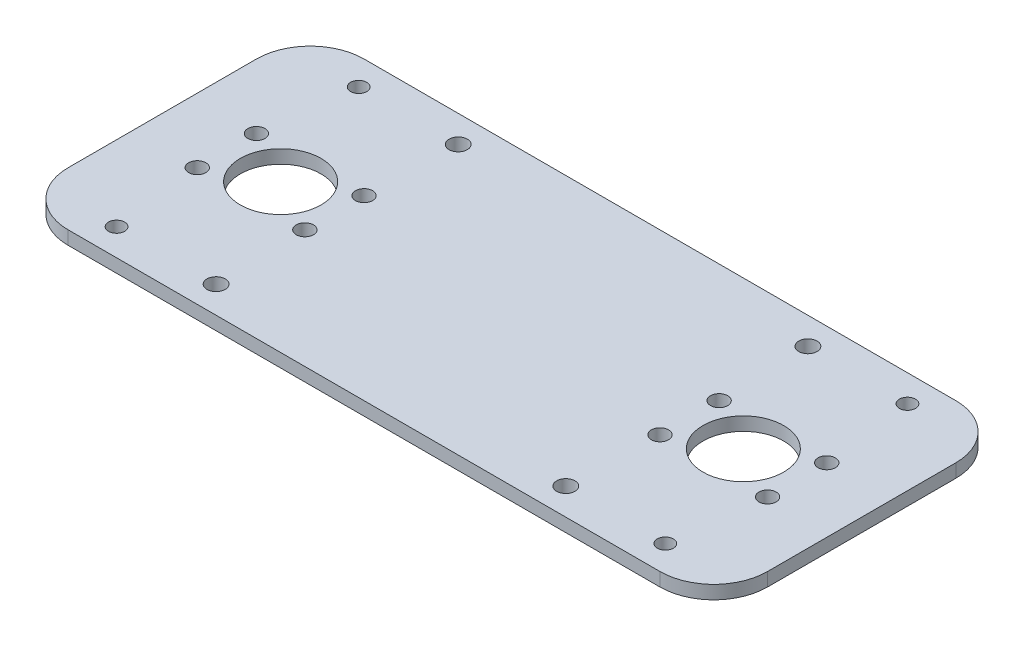
ISO-10303-21;
HEADER;
FILE_DESCRIPTION(('STEP AP214'),'2;1');
FILE_NAME('part.step','',(''),(''),'','','');
FILE_SCHEMA(('AUTOMOTIVE_DESIGN { 1 0 10303 214 1 1 1 1 }'));
ENDSEC;
DATA;
#1=APPLICATION_CONTEXT('core data for automotive mechanical design processes');
#2=APPLICATION_PROTOCOL_DEFINITION('international standard','automotive_design',2000,#1);
#3=PRODUCT_CONTEXT('',#1,'mechanical');
#4=PRODUCT('Part','Part','',(#3));
#5=PRODUCT_RELATED_PRODUCT_CATEGORY('part','',(#4));
#6=PRODUCT_DEFINITION_FORMATION('','',#4);
#7=PRODUCT_DEFINITION_CONTEXT('part definition',#1,'design');
#8=PRODUCT_DEFINITION('design','',#6,#7);
#9=PRODUCT_DEFINITION_SHAPE('','',#8);
#10=(LENGTH_UNIT() NAMED_UNIT(*) SI_UNIT(.MILLI.,.METRE.));
#11=(NAMED_UNIT(*) PLANE_ANGLE_UNIT() SI_UNIT($,.RADIAN.));
#12=(NAMED_UNIT(*) SI_UNIT($,.STERADIAN.) SOLID_ANGLE_UNIT());
#13=UNCERTAINTY_MEASURE_WITH_UNIT(LENGTH_MEASURE(1.E-05),#10,'distance_accuracy_value','');
#14=(GEOMETRIC_REPRESENTATION_CONTEXT(3) GLOBAL_UNCERTAINTY_ASSIGNED_CONTEXT((#13)) GLOBAL_UNIT_ASSIGNED_CONTEXT((#10,
#11,#12)) REPRESENTATION_CONTEXT('',''));
#15=CARTESIAN_POINT('',(0.,0.,0.));
#16=DIRECTION('',(0.,0.,1.));
#17=DIRECTION('',(1.,0.,0.));
#18=AXIS2_PLACEMENT_3D('',#15,#16,#17);
#19=CARTESIAN_POINT('',(10.,2.5,-45.));
#20=DIRECTION('',(0.,-1.,0.));
#21=DIRECTION('',(0.,0.,-1.));
#22=AXIS2_PLACEMENT_3D('',#19,#20,#21);
#23=CYLINDRICAL_SURFACE('',#22,10.);
#24=CARTESIAN_POINT('',(10.,0.,-45.));
#25=DIRECTION('',(0.,1.,0.));
#26=DIRECTION('',(0.,0.,1.));
#27=AXIS2_PLACEMENT_3D('',#24,#25,#26);
#28=CIRCLE('',#27,10.);
#29=CARTESIAN_POINT('',(10.0000000000001,0.,-55.));
#30=VERTEX_POINT('',#29);
#31=CARTESIAN_POINT('',(0.,0.,-44.9999999999999));
#32=VERTEX_POINT('',#31);
#33=EDGE_CURVE('E139',#30,#32,#28,.T.);
#34=ORIENTED_EDGE('',*,*,#33,.T.);
#35=DIRECTION('',(0.,-1.,0.));
#36=VECTOR('',#35,1.);
#37=CARTESIAN_POINT('',(0.,2.5,-44.9999999999999));
#38=LINE('',#37,#36);
#39=CARTESIAN_POINT('',(0.,2.5,-44.9999999999999));
#40=VERTEX_POINT('',#39);
#41=EDGE_CURVE('E11',#40,#32,#38,.T.);
#42=ORIENTED_EDGE('',*,*,#41,.F.);
#43=CARTESIAN_POINT('',(10.,2.5,-45.));
#44=DIRECTION('',(0.,1.,0.));
#45=DIRECTION('',(0.,0.,1.));
#46=AXIS2_PLACEMENT_3D('',#43,#44,#45);
#47=CIRCLE('',#46,10.);
#48=CARTESIAN_POINT('',(10.0000000000001,2.5,-55.));
#49=VERTEX_POINT('',#48);
#50=EDGE_CURVE('E154',#49,#40,#47,.T.);
#51=ORIENTED_EDGE('',*,*,#50,.F.);
#52=DIRECTION('',(0.,-1.,0.));
#53=VECTOR('',#52,1.);
#54=CARTESIAN_POINT('',(10.0000000000001,2.5,-55.));
#55=LINE('',#54,#53);
#56=EDGE_CURVE('E135',#49,#30,#55,.T.);
#57=ORIENTED_EDGE('',*,*,#56,.T.);
#58=EDGE_LOOP('',(#34,#42,#51,#57));
#59=FACE_BOUND('',#58,.T.);
#60=ADVANCED_FACE('F41',(#59),#23,.T.);
#61=CARTESIAN_POINT('',(0.,2.5,-10.0000000000001));
#62=DIRECTION('',(1.,0.,0.));
#63=DIRECTION('',(0.,0.,-1.));
#64=AXIS2_PLACEMENT_3D('',#61,#62,#63);
#65=PLANE('',#64);
#66=DIRECTION('',(0.,0.,1.));
#67=VECTOR('',#66,1.);
#68=CARTESIAN_POINT('',(0.,0.,-10.0000000000001));
#69=LINE('',#68,#67);
#70=CARTESIAN_POINT('',(0.,0.,-10.0000000000001));
#71=VERTEX_POINT('',#70);
#72=EDGE_CURVE('E142',#32,#71,#69,.T.);
#73=ORIENTED_EDGE('',*,*,#72,.T.);
#74=DIRECTION('',(0.,-1.,0.));
#75=VECTOR('',#74,1.);
#76=CARTESIAN_POINT('',(0.,2.5,-10.0000000000001));
#77=LINE('',#76,#75);
#78=CARTESIAN_POINT('',(0.,2.5,-10.0000000000001));
#79=VERTEX_POINT('',#78);
#80=EDGE_CURVE('E50',#79,#71,#77,.T.);
#81=ORIENTED_EDGE('',*,*,#80,.F.);
#82=DIRECTION('',(0.,0.,1.));
#83=VECTOR('',#82,1.);
#84=CARTESIAN_POINT('',(0.,2.5,-10.0000000000001));
#85=LINE('',#84,#83);
#86=EDGE_CURVE('E102',#40,#79,#85,.T.);
#87=ORIENTED_EDGE('',*,*,#86,.F.);
#88=ORIENTED_EDGE('',*,*,#41,.T.);
#89=EDGE_LOOP('',(#73,#81,#87,#88));
#90=FACE_BOUND('',#89,.T.);
#91=ADVANCED_FACE('F290',(#90),#65,.F.);
#92=CARTESIAN_POINT('',(10.,2.5,-10.));
#93=DIRECTION('',(0.,-1.,0.));
#94=DIRECTION('',(0.,0.,-1.));
#95=AXIS2_PLACEMENT_3D('',#92,#93,#94);
#96=CYLINDRICAL_SURFACE('',#95,10.);
#97=CARTESIAN_POINT('',(10.,0.,-10.));
#98=DIRECTION('',(0.,1.,0.));
#99=DIRECTION('',(0.,0.,1.));
#100=AXIS2_PLACEMENT_3D('',#97,#98,#99);
#101=CIRCLE('',#100,10.);
#102=CARTESIAN_POINT('',(10.0000000000001,0.,0.));
#103=VERTEX_POINT('',#102);
#104=EDGE_CURVE('E145',#71,#103,#101,.T.);
#105=ORIENTED_EDGE('',*,*,#104,.T.);
#106=DIRECTION('',(0.,-1.,0.));
#107=VECTOR('',#106,1.);
#108=CARTESIAN_POINT('',(10.0000000000001,2.5,0.));
#109=LINE('',#108,#107);
#110=CARTESIAN_POINT('',(10.0000000000001,2.5,0.));
#111=VERTEX_POINT('',#110);
#112=EDGE_CURVE('E161',#111,#103,#109,.T.);
#113=ORIENTED_EDGE('',*,*,#112,.F.);
#114=CARTESIAN_POINT('',(10.,2.5,-10.));
#115=DIRECTION('',(0.,1.,0.));
#116=DIRECTION('',(0.,0.,1.));
#117=AXIS2_PLACEMENT_3D('',#114,#115,#116);
#118=CIRCLE('',#117,10.);
#119=EDGE_CURVE('E257',#79,#111,#118,.T.);
#120=ORIENTED_EDGE('',*,*,#119,.F.);
#121=ORIENTED_EDGE('',*,*,#80,.T.);
#122=EDGE_LOOP('',(#105,#113,#120,#121));
#123=FACE_BOUND('',#122,.T.);
#124=ADVANCED_FACE('F294',(#123),#96,.T.);
#125=CARTESIAN_POINT('',(10.0000000000001,2.5,0.));
#126=DIRECTION('',(0.,0.,-1.));
#127=DIRECTION('',(-1.,0.,0.));
#128=AXIS2_PLACEMENT_3D('',#125,#126,#127);
#129=PLANE('',#128);
#130=DIRECTION('',(1.,0.,0.));
#131=VECTOR('',#130,1.);
#132=CARTESIAN_POINT('',(10.0000000000001,0.,0.));
#133=LINE('',#132,#131);
#134=CARTESIAN_POINT('',(120.,0.,0.));
#135=VERTEX_POINT('',#134);
#136=EDGE_CURVE('E147',#103,#135,#133,.T.);
#137=ORIENTED_EDGE('',*,*,#136,.T.);
#138=DIRECTION('',(0.,-1.,0.));
#139=VECTOR('',#138,1.);
#140=CARTESIAN_POINT('',(120.,2.5,0.));
#141=LINE('',#140,#139);
#142=CARTESIAN_POINT('',(120.,2.5,0.));
#143=VERTEX_POINT('',#142);
#144=EDGE_CURVE('E158',#143,#135,#141,.T.);
#145=ORIENTED_EDGE('',*,*,#144,.F.);
#146=DIRECTION('',(1.,0.,0.));
#147=VECTOR('',#146,1.);
#148=CARTESIAN_POINT('',(10.0000000000001,2.5,0.));
#149=LINE('',#148,#147);
#150=EDGE_CURVE('E259',#111,#143,#149,.T.);
#151=ORIENTED_EDGE('',*,*,#150,.F.);
#152=ORIENTED_EDGE('',*,*,#112,.T.);
#153=EDGE_LOOP('',(#137,#145,#151,#152));
#154=FACE_BOUND('',#153,.T.);
#155=ADVANCED_FACE('F265',(#154),#129,.F.);
#156=CARTESIAN_POINT('',(120.,2.5,-10.));
#157=DIRECTION('',(0.,-1.,0.));
#158=DIRECTION('',(0.,0.,-1.));
#159=AXIS2_PLACEMENT_3D('',#156,#157,#158);
#160=CYLINDRICAL_SURFACE('',#159,10.);
#161=CARTESIAN_POINT('',(120.,0.,-10.));
#162=DIRECTION('',(0.,1.,0.));
#163=DIRECTION('',(0.,0.,-1.));
#164=AXIS2_PLACEMENT_3D('',#161,#162,#163);
#165=CIRCLE('',#164,10.);
#166=CARTESIAN_POINT('',(130.,0.,-10.0000000000001));
#167=VERTEX_POINT('',#166);
#168=EDGE_CURVE('E149',#135,#167,#165,.T.);
#169=ORIENTED_EDGE('',*,*,#168,.T.);
#170=DIRECTION('',(0.,-1.,0.));
#171=VECTOR('',#170,1.);
#172=CARTESIAN_POINT('',(130.,2.5,-10.0000000000001));
#173=LINE('',#172,#171);
#174=CARTESIAN_POINT('',(130.,2.5,-10.0000000000001));
#175=VERTEX_POINT('',#174);
#176=EDGE_CURVE('E130',#175,#167,#173,.T.);
#177=ORIENTED_EDGE('',*,*,#176,.F.);
#178=CARTESIAN_POINT('',(120.,2.5,-10.));
#179=DIRECTION('',(0.,1.,0.));
#180=DIRECTION('',(0.,0.,-1.));
#181=AXIS2_PLACEMENT_3D('',#178,#179,#180);
#182=CIRCLE('',#181,10.);
#183=EDGE_CURVE('E121',#143,#175,#182,.T.);
#184=ORIENTED_EDGE('',*,*,#183,.F.);
#185=ORIENTED_EDGE('',*,*,#144,.T.);
#186=EDGE_LOOP('',(#169,#177,#184,#185));
#187=FACE_BOUND('',#186,.T.);
#188=ADVANCED_FACE('F269',(#187),#160,.T.);
#189=CARTESIAN_POINT('',(130.,2.5,-10.0000000000001));
#190=DIRECTION('',(-1.,0.,0.));
#191=DIRECTION('',(0.,0.,1.));
#192=AXIS2_PLACEMENT_3D('',#189,#190,#191);
#193=PLANE('',#192);
#194=DIRECTION('',(0.,0.,-1.));
#195=VECTOR('',#194,1.);
#196=CARTESIAN_POINT('',(130.,0.,-10.0000000000001));
#197=LINE('',#196,#195);
#198=CARTESIAN_POINT('',(130.,0.,-44.9999999999999));
#199=VERTEX_POINT('',#198);
#200=EDGE_CURVE('E129',#167,#199,#197,.T.);
#201=ORIENTED_EDGE('',*,*,#200,.T.);
#202=DIRECTION('',(0.,-1.,0.));
#203=VECTOR('',#202,1.);
#204=CARTESIAN_POINT('',(130.,2.5,-44.9999999999999));
#205=LINE('',#204,#203);
#206=CARTESIAN_POINT('',(130.,2.5,-44.9999999999999));
#207=VERTEX_POINT('',#206);
#208=EDGE_CURVE('E126',#207,#199,#205,.T.);
#209=ORIENTED_EDGE('',*,*,#208,.F.);
#210=DIRECTION('',(0.,0.,-1.));
#211=VECTOR('',#210,1.);
#212=CARTESIAN_POINT('',(130.,2.5,-10.0000000000001));
#213=LINE('',#212,#211);
#214=EDGE_CURVE('E115',#175,#207,#213,.T.);
#215=ORIENTED_EDGE('',*,*,#214,.F.);
#216=ORIENTED_EDGE('',*,*,#176,.T.);
#217=EDGE_LOOP('',(#201,#209,#215,#216));
#218=FACE_BOUND('',#217,.T.);
#219=ADVANCED_FACE('F127',(#218),#193,.F.);
#220=CARTESIAN_POINT('',(120.,2.5,-45.));
#221=DIRECTION('',(0.,-1.,0.));
#222=DIRECTION('',(0.,0.,-1.));
#223=AXIS2_PLACEMENT_3D('',#220,#221,#222);
#224=CYLINDRICAL_SURFACE('',#223,10.);
#225=CARTESIAN_POINT('',(120.,0.,-45.));
#226=DIRECTION('',(0.,1.,0.));
#227=DIRECTION('',(0.,0.,-1.));
#228=AXIS2_PLACEMENT_3D('',#225,#226,#227);
#229=CIRCLE('',#228,10.);
#230=CARTESIAN_POINT('',(120.,0.,-55.));
#231=VERTEX_POINT('',#230);
#232=EDGE_CURVE('E88',#199,#231,#229,.T.);
#233=ORIENTED_EDGE('',*,*,#232,.T.);
#234=DIRECTION('',(0.,-1.,0.));
#235=VECTOR('',#234,1.);
#236=CARTESIAN_POINT('',(120.,2.5,-55.));
#237=LINE('',#236,#235);
#238=CARTESIAN_POINT('',(120.,2.5,-55.));
#239=VERTEX_POINT('',#238);
#240=EDGE_CURVE('E131',#239,#231,#237,.T.);
#241=ORIENTED_EDGE('',*,*,#240,.F.);
#242=CARTESIAN_POINT('',(120.,2.5,-45.));
#243=DIRECTION('',(0.,1.,0.));
#244=DIRECTION('',(0.,0.,-1.));
#245=AXIS2_PLACEMENT_3D('',#242,#243,#244);
#246=CIRCLE('',#245,10.);
#247=EDGE_CURVE('E119',#207,#239,#246,.T.);
#248=ORIENTED_EDGE('',*,*,#247,.F.);
#249=ORIENTED_EDGE('',*,*,#208,.T.);
#250=EDGE_LOOP('',(#233,#241,#248,#249));
#251=FACE_BOUND('',#250,.T.);
#252=ADVANCED_FACE('F133',(#251),#224,.T.);
#253=CARTESIAN_POINT('',(10.0000000000001,2.5,-55.));
#254=DIRECTION('',(0.,0.,1.));
#255=DIRECTION('',(1.,0.,0.));
#256=AXIS2_PLACEMENT_3D('',#253,#254,#255);
#257=PLANE('',#256);
#258=DIRECTION('',(-1.,0.,0.));
#259=VECTOR('',#258,1.);
#260=CARTESIAN_POINT('',(10.0000000000001,0.,-55.));
#261=LINE('',#260,#259);
#262=EDGE_CURVE('E94',#231,#30,#261,.T.);
#263=ORIENTED_EDGE('',*,*,#262,.T.);
#264=ORIENTED_EDGE('',*,*,#56,.F.);
#265=DIRECTION('',(-1.,0.,0.));
#266=VECTOR('',#265,1.);
#267=CARTESIAN_POINT('',(10.0000000000001,2.5,-55.));
#268=LINE('',#267,#266);
#269=EDGE_CURVE('E59',#239,#49,#268,.T.);
#270=ORIENTED_EDGE('',*,*,#269,.F.);
#271=ORIENTED_EDGE('',*,*,#240,.T.);
#272=EDGE_LOOP('',(#263,#264,#270,#271));
#273=FACE_BOUND('',#272,.T.);
#274=ADVANCED_FACE('F277',(#273),#257,.F.);
#275=CARTESIAN_POINT('',(10.,2.5,-45.));
#276=DIRECTION('',(0.,1.,0.));
#277=DIRECTION('',(0.,0.,1.));
#278=AXIS2_PLACEMENT_3D('',#275,#276,#277);
#279=PLANE('',#278);
#280=CARTESIAN_POINT('',(22.,2.5,-27.5));
#281=DIRECTION('',(0.,1.,0.));
#282=DIRECTION('',(0.,0.,1.));
#283=AXIS2_PLACEMENT_3D('',#280,#281,#282);
#284=CIRCLE('',#283,7.5);
#285=CARTESIAN_POINT('',(22.,2.5,-20.));
#286=VERTEX_POINT('',#285);
#287=EDGE_CURVE('E513',#286,#286,#284,.T.);
#288=ORIENTED_EDGE('',*,*,#287,.F.);
#289=EDGE_LOOP('',(#288));
#290=FACE_BOUND('',#289,.T.);
#291=CARTESIAN_POINT('',(108.,2.5,-27.5));
#292=DIRECTION('',(0.,1.,0.));
#293=DIRECTION('',(0.,0.,1.));
#294=AXIS2_PLACEMENT_3D('',#291,#292,#293);
#295=CIRCLE('',#294,7.50000000000001);
#296=CARTESIAN_POINT('',(108.,2.5,-20.));
#297=VERTEX_POINT('',#296);
#298=EDGE_CURVE('E517',#297,#297,#295,.T.);
#299=ORIENTED_EDGE('',*,*,#298,.F.);
#300=EDGE_LOOP('',(#299));
#301=FACE_BOUND('',#300,.T.);
#302=CARTESIAN_POINT('',(32.5,2.5,-50.));
#303=DIRECTION('',(0.,1.,0.));
#304=DIRECTION('',(0.,0.,1.));
#305=AXIS2_PLACEMENT_3D('',#302,#303,#304);
#306=CIRCLE('',#305,1.7);
#307=CARTESIAN_POINT('',(32.5,2.5,-48.3));
#308=VERTEX_POINT('',#307);
#309=EDGE_CURVE('E530',#308,#308,#306,.T.);
#310=ORIENTED_EDGE('',*,*,#309,.F.);
#311=EDGE_LOOP('',(#310));
#312=FACE_BOUND('',#311,.T.);
#313=CARTESIAN_POINT('',(97.5,2.5,-5.00000000000001));
#314=DIRECTION('',(0.,1.,0.));
#315=DIRECTION('',(0.,0.,1.));
#316=AXIS2_PLACEMENT_3D('',#313,#314,#315);
#317=CIRCLE('',#316,1.7);
#318=CARTESIAN_POINT('',(97.5,2.5,-3.30000000000001));
#319=VERTEX_POINT('',#318);
#320=EDGE_CURVE('E529',#319,#319,#317,.T.);
#321=ORIENTED_EDGE('',*,*,#320,.F.);
#322=EDGE_LOOP('',(#321));
#323=FACE_BOUND('',#322,.T.);
#324=CARTESIAN_POINT('',(32.5,2.5,-5.));
#325=DIRECTION('',(0.,1.,0.));
#326=DIRECTION('',(0.,0.,-1.));
#327=AXIS2_PLACEMENT_3D('',#324,#325,#326);
#328=CIRCLE('',#327,1.7);
#329=CARTESIAN_POINT('',(32.5,2.5,-6.7));
#330=VERTEX_POINT('',#329);
#331=EDGE_CURVE('E526',#330,#330,#328,.T.);
#332=ORIENTED_EDGE('',*,*,#331,.F.);
#333=EDGE_LOOP('',(#332));
#334=FACE_BOUND('',#333,.T.);
#335=CARTESIAN_POINT('',(97.5,2.5,-50.));
#336=DIRECTION('',(0.,1.,0.));
#337=DIRECTION('',(0.,0.,-1.));
#338=AXIS2_PLACEMENT_3D('',#335,#336,#337);
#339=CIRCLE('',#338,1.7);
#340=CARTESIAN_POINT('',(97.5,2.5,-51.7));
#341=VERTEX_POINT('',#340);
#342=EDGE_CURVE('E200',#341,#341,#339,.T.);
#343=ORIENTED_EDGE('',*,*,#342,.F.);
#344=EDGE_LOOP('',(#343));
#345=FACE_BOUND('',#344,.T.);
#346=CARTESIAN_POINT('',(98.,2.5,-22.));
#347=DIRECTION('',(0.,1.,0.));
#348=DIRECTION('',(0.,0.,1.));
#349=AXIS2_PLACEMENT_3D('',#346,#347,#348);
#350=CIRCLE('',#349,1.6);
#351=CARTESIAN_POINT('',(98.,2.5,-20.4));
#352=VERTEX_POINT('',#351);
#353=EDGE_CURVE('E216',#352,#352,#350,.T.);
#354=ORIENTED_EDGE('',*,*,#353,.F.);
#355=EDGE_LOOP('',(#354));
#356=FACE_BOUND('',#355,.T.);
#357=CARTESIAN_POINT('',(118.,2.5,-33.));
#358=DIRECTION('',(0.,1.,0.));
#359=DIRECTION('',(0.,0.,1.));
#360=AXIS2_PLACEMENT_3D('',#357,#358,#359);
#361=CIRCLE('',#360,1.60000000000001);
#362=CARTESIAN_POINT('',(118.,2.5,-31.4));
#363=VERTEX_POINT('',#362);
#364=EDGE_CURVE('E211',#363,#363,#361,.T.);
#365=ORIENTED_EDGE('',*,*,#364,.F.);
#366=EDGE_LOOP('',(#365));
#367=FACE_BOUND('',#366,.T.);
#368=CARTESIAN_POINT('',(118.,2.5,-22.));
#369=DIRECTION('',(0.,1.,0.));
#370=DIRECTION('',(0.,0.,1.));
#371=AXIS2_PLACEMENT_3D('',#368,#369,#370);
#372=CIRCLE('',#371,1.6);
#373=CARTESIAN_POINT('',(118.,2.5,-20.4));
#374=VERTEX_POINT('',#373);
#375=EDGE_CURVE('E207',#374,#374,#372,.T.);
#376=ORIENTED_EDGE('',*,*,#375,.F.);
#377=EDGE_LOOP('',(#376));
#378=FACE_BOUND('',#377,.T.);
#379=CARTESIAN_POINT('',(98.,2.5,-33.));
#380=DIRECTION('',(0.,1.,0.));
#381=DIRECTION('',(0.,0.,1.));
#382=AXIS2_PLACEMENT_3D('',#379,#380,#381);
#383=CIRCLE('',#382,1.60000000000001);
#384=CARTESIAN_POINT('',(98.,2.5,-31.4));
#385=VERTEX_POINT('',#384);
#386=EDGE_CURVE('E186',#385,#385,#383,.T.);
#387=ORIENTED_EDGE('',*,*,#386,.F.);
#388=EDGE_LOOP('',(#387));
#389=FACE_BOUND('',#388,.T.);
#390=CARTESIAN_POINT('',(32.,2.5,-33.));
#391=DIRECTION('',(0.,1.,0.));
#392=DIRECTION('',(0.,0.,1.));
#393=AXIS2_PLACEMENT_3D('',#390,#391,#392);
#394=CIRCLE('',#393,1.6);
#395=CARTESIAN_POINT('',(32.,2.5,-31.4));
#396=VERTEX_POINT('',#395);
#397=EDGE_CURVE('E179',#396,#396,#394,.T.);
#398=ORIENTED_EDGE('',*,*,#397,.F.);
#399=EDGE_LOOP('',(#398));
#400=FACE_BOUND('',#399,.T.);
#401=CARTESIAN_POINT('',(32.,2.5,-22.));
#402=DIRECTION('',(0.,1.,0.));
#403=DIRECTION('',(0.,0.,1.));
#404=AXIS2_PLACEMENT_3D('',#401,#402,#403);
#405=CIRCLE('',#404,1.6);
#406=CARTESIAN_POINT('',(32.,2.5,-20.4));
#407=VERTEX_POINT('',#406);
#408=EDGE_CURVE('E195',#407,#407,#405,.T.);
#409=ORIENTED_EDGE('',*,*,#408,.F.);
#410=EDGE_LOOP('',(#409));
#411=FACE_BOUND('',#410,.T.);
#412=CARTESIAN_POINT('',(12.,2.5,-22.));
#413=DIRECTION('',(0.,1.,0.));
#414=DIRECTION('',(0.,0.,1.));
#415=AXIS2_PLACEMENT_3D('',#412,#413,#414);
#416=CIRCLE('',#415,1.6);
#417=CARTESIAN_POINT('',(12.,2.5,-20.4));
#418=VERTEX_POINT('',#417);
#419=EDGE_CURVE('E174',#418,#418,#416,.T.);
#420=ORIENTED_EDGE('',*,*,#419,.F.);
#421=EDGE_LOOP('',(#420));
#422=FACE_BOUND('',#421,.T.);
#423=CARTESIAN_POINT('',(12.,2.5,-33.));
#424=DIRECTION('',(0.,1.,0.));
#425=DIRECTION('',(0.,0.,1.));
#426=AXIS2_PLACEMENT_3D('',#423,#424,#425);
#427=CIRCLE('',#426,1.6);
#428=CARTESIAN_POINT('',(12.,2.5,-31.4));
#429=VERTEX_POINT('',#428);
#430=EDGE_CURVE('E170',#429,#429,#427,.T.);
#431=ORIENTED_EDGE('',*,*,#430,.F.);
#432=EDGE_LOOP('',(#431));
#433=FACE_BOUND('',#432,.T.);
#434=CARTESIAN_POINT('',(116.,2.5,-50.));
#435=DIRECTION('',(0.,1.,0.));
#436=DIRECTION('',(0.,0.,-1.));
#437=AXIS2_PLACEMENT_3D('',#434,#435,#436);
#438=CIRCLE('',#437,1.5);
#439=CARTESIAN_POINT('',(116.,2.5,-51.5));
#440=VERTEX_POINT('',#439);
#441=EDGE_CURVE('E169',#440,#440,#438,.T.);
#442=ORIENTED_EDGE('',*,*,#441,.F.);
#443=EDGE_LOOP('',(#442));
#444=FACE_BOUND('',#443,.T.);
#445=CARTESIAN_POINT('',(116.,2.5,-4.99999999999997));
#446=DIRECTION('',(0.,1.,0.));
#447=DIRECTION('',(0.,0.,-1.));
#448=AXIS2_PLACEMENT_3D('',#445,#446,#447);
#449=CIRCLE('',#448,1.5);
#450=CARTESIAN_POINT('',(116.,2.5,-6.49999999999997));
#451=VERTEX_POINT('',#450);
#452=EDGE_CURVE('E236',#451,#451,#449,.T.);
#453=ORIENTED_EDGE('',*,*,#452,.F.);
#454=EDGE_LOOP('',(#453));
#455=FACE_BOUND('',#454,.T.);
#456=CARTESIAN_POINT('',(14.,2.5,-50.));
#457=DIRECTION('',(0.,1.,0.));
#458=DIRECTION('',(0.,0.,1.));
#459=AXIS2_PLACEMENT_3D('',#456,#457,#458);
#460=CIRCLE('',#459,1.5);
#461=CARTESIAN_POINT('',(14.,2.5,-48.5));
#462=VERTEX_POINT('',#461);
#463=EDGE_CURVE('E242',#462,#462,#460,.T.);
#464=ORIENTED_EDGE('',*,*,#463,.F.);
#465=EDGE_LOOP('',(#464));
#466=FACE_BOUND('',#465,.T.);
#467=CARTESIAN_POINT('',(14.,2.5,-5.));
#468=DIRECTION('',(0.,1.,0.));
#469=DIRECTION('',(0.,0.,1.));
#470=AXIS2_PLACEMENT_3D('',#467,#468,#469);
#471=CIRCLE('',#470,1.5);
#472=CARTESIAN_POINT('',(14.,2.5,-3.5));
#473=VERTEX_POINT('',#472);
#474=EDGE_CURVE('E248',#473,#473,#471,.T.);
#475=ORIENTED_EDGE('',*,*,#474,.F.);
#476=EDGE_LOOP('',(#475));
#477=FACE_BOUND('',#476,.T.);
#478=ORIENTED_EDGE('',*,*,#50,.T.);
#479=ORIENTED_EDGE('',*,*,#86,.T.);
#480=ORIENTED_EDGE('',*,*,#119,.T.);
#481=ORIENTED_EDGE('',*,*,#150,.T.);
#482=ORIENTED_EDGE('',*,*,#183,.T.);
#483=ORIENTED_EDGE('',*,*,#214,.T.);
#484=ORIENTED_EDGE('',*,*,#247,.T.);
#485=ORIENTED_EDGE('',*,*,#269,.T.);
#486=EDGE_LOOP('',(#478,#479,#480,#481,#482,#483,#484,#485));
#487=FACE_BOUND('',#486,.T.);
#488=ADVANCED_FACE('F117',(#290,#301,#312,#323,#334,#345,#356,#367,#378,#389,#400,#411,#422,
#433,#444,#455,#466,#477,#487),#279,.T.);
#489=CARTESIAN_POINT('',(10.,0.,-45.));
#490=DIRECTION('',(0.,1.,0.));
#491=DIRECTION('',(0.,0.,1.));
#492=AXIS2_PLACEMENT_3D('',#489,#490,#491);
#493=PLANE('',#492);
#494=CARTESIAN_POINT('',(22.,0.,-27.5));
#495=DIRECTION('',(0.,-1.,0.));
#496=DIRECTION('',(0.,0.,-1.));
#497=AXIS2_PLACEMENT_3D('',#494,#495,#496);
#498=CIRCLE('',#497,7.5);
#499=CARTESIAN_POINT('',(22.,0.,-35.));
#500=VERTEX_POINT('',#499);
#501=EDGE_CURVE('E516',#500,#500,#498,.T.);
#502=ORIENTED_EDGE('',*,*,#501,.F.);
#503=EDGE_LOOP('',(#502));
#504=FACE_BOUND('',#503,.T.);
#505=CARTESIAN_POINT('',(108.,0.,-27.5));
#506=DIRECTION('',(0.,-1.,0.));
#507=DIRECTION('',(0.,0.,1.));
#508=AXIS2_PLACEMENT_3D('',#505,#506,#507);
#509=CIRCLE('',#508,7.50000000000001);
#510=CARTESIAN_POINT('',(108.,0.,-20.));
#511=VERTEX_POINT('',#510);
#512=EDGE_CURVE('E518',#511,#511,#509,.T.);
#513=ORIENTED_EDGE('',*,*,#512,.F.);
#514=EDGE_LOOP('',(#513));
#515=FACE_BOUND('',#514,.T.);
#516=CARTESIAN_POINT('',(32.5,0.,-50.));
#517=DIRECTION('',(0.,1.,0.));
#518=DIRECTION('',(0.,0.,1.));
#519=AXIS2_PLACEMENT_3D('',#516,#517,#518);
#520=CIRCLE('',#519,1.7);
#521=CARTESIAN_POINT('',(32.5,0.,-48.3));
#522=VERTEX_POINT('',#521);
#523=EDGE_CURVE('E44',#522,#522,#520,.T.);
#524=ORIENTED_EDGE('',*,*,#523,.T.);
#525=EDGE_LOOP('',(#524));
#526=FACE_BOUND('',#525,.T.);
#527=CARTESIAN_POINT('',(97.5,0.,-5.00000000000001));
#528=DIRECTION('',(0.,1.,0.));
#529=DIRECTION('',(0.,0.,1.));
#530=AXIS2_PLACEMENT_3D('',#527,#528,#529);
#531=CIRCLE('',#530,1.7);
#532=CARTESIAN_POINT('',(97.5,0.,-3.30000000000001));
#533=VERTEX_POINT('',#532);
#534=EDGE_CURVE('E202',#533,#533,#531,.T.);
#535=ORIENTED_EDGE('',*,*,#534,.T.);
#536=EDGE_LOOP('',(#535));
#537=FACE_BOUND('',#536,.T.);
#538=CARTESIAN_POINT('',(32.5,0.,-5.));
#539=DIRECTION('',(0.,1.,0.));
#540=DIRECTION('',(0.,0.,1.));
#541=AXIS2_PLACEMENT_3D('',#538,#539,#540);
#542=CIRCLE('',#541,1.7);
#543=CARTESIAN_POINT('',(32.5,0.,-3.3));
#544=VERTEX_POINT('',#543);
#545=EDGE_CURVE('E199',#544,#544,#542,.T.);
#546=ORIENTED_EDGE('',*,*,#545,.T.);
#547=EDGE_LOOP('',(#546));
#548=FACE_BOUND('',#547,.T.);
#549=CARTESIAN_POINT('',(97.5,0.,-50.));
#550=DIRECTION('',(0.,1.,0.));
#551=DIRECTION('',(0.,0.,1.));
#552=AXIS2_PLACEMENT_3D('',#549,#550,#551);
#553=CIRCLE('',#552,1.7);
#554=CARTESIAN_POINT('',(97.5,0.,-48.3));
#555=VERTEX_POINT('',#554);
#556=EDGE_CURVE('E196',#555,#555,#553,.T.);
#557=ORIENTED_EDGE('',*,*,#556,.T.);
#558=EDGE_LOOP('',(#557));
#559=FACE_BOUND('',#558,.T.);
#560=CARTESIAN_POINT('',(98.,0.,-22.));
#561=DIRECTION('',(0.,1.,0.));
#562=DIRECTION('',(0.,0.,1.));
#563=AXIS2_PLACEMENT_3D('',#560,#561,#562);
#564=CIRCLE('',#563,1.6);
#565=CARTESIAN_POINT('',(98.,0.,-20.4));
#566=VERTEX_POINT('',#565);
#567=EDGE_CURVE('E192',#566,#566,#564,.T.);
#568=ORIENTED_EDGE('',*,*,#567,.T.);
#569=EDGE_LOOP('',(#568));
#570=FACE_BOUND('',#569,.T.);
#571=CARTESIAN_POINT('',(118.,0.,-33.));
#572=DIRECTION('',(0.,1.,0.));
#573=DIRECTION('',(0.,0.,1.));
#574=AXIS2_PLACEMENT_3D('',#571,#572,#573);
#575=CIRCLE('',#574,1.60000000000001);
#576=CARTESIAN_POINT('',(118.,0.,-31.4));
#577=VERTEX_POINT('',#576);
#578=EDGE_CURVE('E189',#577,#577,#575,.T.);
#579=ORIENTED_EDGE('',*,*,#578,.T.);
#580=EDGE_LOOP('',(#579));
#581=FACE_BOUND('',#580,.T.);
#582=CARTESIAN_POINT('',(118.,0.,-22.));
#583=DIRECTION('',(0.,1.,0.));
#584=DIRECTION('',(0.,0.,1.));
#585=AXIS2_PLACEMENT_3D('',#582,#583,#584);
#586=CIRCLE('',#585,1.6);
#587=CARTESIAN_POINT('',(118.,0.,-20.4));
#588=VERTEX_POINT('',#587);
#589=EDGE_CURVE('E185',#588,#588,#586,.T.);
#590=ORIENTED_EDGE('',*,*,#589,.T.);
#591=EDGE_LOOP('',(#590));
#592=FACE_BOUND('',#591,.T.);
#593=CARTESIAN_POINT('',(98.,0.,-33.));
#594=DIRECTION('',(0.,1.,0.));
#595=DIRECTION('',(0.,0.,1.));
#596=AXIS2_PLACEMENT_3D('',#593,#594,#595);
#597=CIRCLE('',#596,1.60000000000001);
#598=CARTESIAN_POINT('',(98.,0.,-31.4));
#599=VERTEX_POINT('',#598);
#600=EDGE_CURVE('E182',#599,#599,#597,.T.);
#601=ORIENTED_EDGE('',*,*,#600,.T.);
#602=EDGE_LOOP('',(#601));
#603=FACE_BOUND('',#602,.T.);
#604=CARTESIAN_POINT('',(32.,0.,-33.));
#605=DIRECTION('',(0.,1.,0.));
#606=DIRECTION('',(0.,0.,1.));
#607=AXIS2_PLACEMENT_3D('',#604,#605,#606);
#608=CIRCLE('',#607,1.6);
#609=CARTESIAN_POINT('',(32.,0.,-31.4));
#610=VERTEX_POINT('',#609);
#611=EDGE_CURVE('E178',#610,#610,#608,.T.);
#612=ORIENTED_EDGE('',*,*,#611,.T.);
#613=EDGE_LOOP('',(#612));
#614=FACE_BOUND('',#613,.T.);
#615=CARTESIAN_POINT('',(32.,0.,-22.));
#616=DIRECTION('',(0.,1.,0.));
#617=DIRECTION('',(0.,0.,1.));
#618=AXIS2_PLACEMENT_3D('',#615,#616,#617);
#619=CIRCLE('',#618,1.6);
#620=CARTESIAN_POINT('',(32.,0.,-20.4));
#621=VERTEX_POINT('',#620);
#622=EDGE_CURVE('E175',#621,#621,#619,.T.);
#623=ORIENTED_EDGE('',*,*,#622,.T.);
#624=EDGE_LOOP('',(#623));
#625=FACE_BOUND('',#624,.T.);
#626=CARTESIAN_POINT('',(12.,0.,-22.));
#627=DIRECTION('',(0.,1.,0.));
#628=DIRECTION('',(0.,0.,1.));
#629=AXIS2_PLACEMENT_3D('',#626,#627,#628);
#630=CIRCLE('',#629,1.6);
#631=CARTESIAN_POINT('',(12.,0.,-20.4));
#632=VERTEX_POINT('',#631);
#633=EDGE_CURVE('E171',#632,#632,#630,.T.);
#634=ORIENTED_EDGE('',*,*,#633,.T.);
#635=EDGE_LOOP('',(#634));
#636=FACE_BOUND('',#635,.T.);
#637=CARTESIAN_POINT('',(12.,0.,-33.));
#638=DIRECTION('',(0.,1.,0.));
#639=DIRECTION('',(0.,0.,1.));
#640=AXIS2_PLACEMENT_3D('',#637,#638,#639);
#641=CIRCLE('',#640,1.6);
#642=CARTESIAN_POINT('',(12.,0.,-31.4));
#643=VERTEX_POINT('',#642);
#644=EDGE_CURVE('E166',#643,#643,#641,.T.);
#645=ORIENTED_EDGE('',*,*,#644,.T.);
#646=EDGE_LOOP('',(#645));
#647=FACE_BOUND('',#646,.T.);
#648=CARTESIAN_POINT('',(116.,0.,-50.));
#649=DIRECTION('',(0.,1.,0.));
#650=DIRECTION('',(0.,0.,-1.));
#651=AXIS2_PLACEMENT_3D('',#648,#649,#650);
#652=CIRCLE('',#651,1.5);
#653=CARTESIAN_POINT('',(116.,0.,-51.5));
#654=VERTEX_POINT('',#653);
#655=EDGE_CURVE('E233',#654,#654,#652,.T.);
#656=ORIENTED_EDGE('',*,*,#655,.T.);
#657=EDGE_LOOP('',(#656));
#658=FACE_BOUND('',#657,.T.);
#659=CARTESIAN_POINT('',(116.,0.,-4.99999999999997));
#660=DIRECTION('',(0.,1.,0.));
#661=DIRECTION('',(0.,0.,-1.));
#662=AXIS2_PLACEMENT_3D('',#659,#660,#661);
#663=CIRCLE('',#662,1.5);
#664=CARTESIAN_POINT('',(116.,0.,-6.49999999999997));
#665=VERTEX_POINT('',#664);
#666=EDGE_CURVE('E239',#665,#665,#663,.T.);
#667=ORIENTED_EDGE('',*,*,#666,.T.);
#668=EDGE_LOOP('',(#667));
#669=FACE_BOUND('',#668,.T.);
#670=CARTESIAN_POINT('',(14.,0.,-50.));
#671=DIRECTION('',(0.,1.,0.));
#672=DIRECTION('',(0.,0.,1.));
#673=AXIS2_PLACEMENT_3D('',#670,#671,#672);
#674=CIRCLE('',#673,1.5);
#675=CARTESIAN_POINT('',(14.,0.,-48.5));
#676=VERTEX_POINT('',#675);
#677=EDGE_CURVE('E245',#676,#676,#674,.T.);
#678=ORIENTED_EDGE('',*,*,#677,.T.);
#679=EDGE_LOOP('',(#678));
#680=FACE_BOUND('',#679,.T.);
#681=CARTESIAN_POINT('',(14.,0.,-5.));
#682=DIRECTION('',(0.,1.,0.));
#683=DIRECTION('',(0.,0.,1.));
#684=AXIS2_PLACEMENT_3D('',#681,#682,#683);
#685=CIRCLE('',#684,1.5);
#686=CARTESIAN_POINT('',(14.,0.,-3.5));
#687=VERTEX_POINT('',#686);
#688=EDGE_CURVE('E143',#687,#687,#685,.T.);
#689=ORIENTED_EDGE('',*,*,#688,.T.);
#690=EDGE_LOOP('',(#689));
#691=FACE_BOUND('',#690,.T.);
#692=ORIENTED_EDGE('',*,*,#33,.F.);
#693=ORIENTED_EDGE('',*,*,#262,.F.);
#694=ORIENTED_EDGE('',*,*,#232,.F.);
#695=ORIENTED_EDGE('',*,*,#200,.F.);
#696=ORIENTED_EDGE('',*,*,#168,.F.);
#697=ORIENTED_EDGE('',*,*,#136,.F.);
#698=ORIENTED_EDGE('',*,*,#104,.F.);
#699=ORIENTED_EDGE('',*,*,#72,.F.);
#700=EDGE_LOOP('',(#692,#693,#694,#695,#696,#697,#698,#699));
#701=FACE_BOUND('',#700,.T.);
#702=ADVANCED_FACE('F272',(#504,#515,#526,#537,#548,#559,#570,#581,#592,#603,#614,#625,#636,
#647,#658,#669,#680,#691,#701),#493,.F.);
#703=CARTESIAN_POINT('',(14.,0.,-5.));
#704=DIRECTION('',(0.,1.,0.));
#705=DIRECTION('',(0.,0.,1.));
#706=AXIS2_PLACEMENT_3D('',#703,#704,#705);
#707=CYLINDRICAL_SURFACE('',#706,1.5);
#708=ORIENTED_EDGE('',*,*,#688,.F.);
#709=EDGE_LOOP('',(#708));
#710=FACE_BOUND('',#709,.T.);
#711=ORIENTED_EDGE('',*,*,#474,.T.);
#712=EDGE_LOOP('',(#711));
#713=FACE_BOUND('',#712,.T.);
#714=ADVANCED_FACE('F324',(#710,#713),#707,.F.);
#715=CARTESIAN_POINT('',(14.,0.,-50.));
#716=DIRECTION('',(0.,1.,0.));
#717=DIRECTION('',(0.,0.,1.));
#718=AXIS2_PLACEMENT_3D('',#715,#716,#717);
#719=CYLINDRICAL_SURFACE('',#718,1.5);
#720=ORIENTED_EDGE('',*,*,#677,.F.);
#721=EDGE_LOOP('',(#720));
#722=FACE_BOUND('',#721,.T.);
#723=ORIENTED_EDGE('',*,*,#463,.T.);
#724=EDGE_LOOP('',(#723));
#725=FACE_BOUND('',#724,.T.);
#726=ADVANCED_FACE('F329',(#722,#725),#719,.F.);
#727=CARTESIAN_POINT('',(116.,0.,-4.99999999999997));
#728=DIRECTION('',(0.,1.,0.));
#729=DIRECTION('',(0.,0.,1.));
#730=AXIS2_PLACEMENT_3D('',#727,#728,#729);
#731=CYLINDRICAL_SURFACE('',#730,1.5);
#732=ORIENTED_EDGE('',*,*,#666,.F.);
#733=EDGE_LOOP('',(#732));
#734=FACE_BOUND('',#733,.T.);
#735=ORIENTED_EDGE('',*,*,#452,.T.);
#736=EDGE_LOOP('',(#735));
#737=FACE_BOUND('',#736,.T.);
#738=ADVANCED_FACE('F341',(#734,#737),#731,.F.);
#739=CARTESIAN_POINT('',(116.,0.,-50.));
#740=DIRECTION('',(0.,1.,0.));
#741=DIRECTION('',(0.,0.,1.));
#742=AXIS2_PLACEMENT_3D('',#739,#740,#741);
#743=CYLINDRICAL_SURFACE('',#742,1.5);
#744=ORIENTED_EDGE('',*,*,#655,.F.);
#745=EDGE_LOOP('',(#744));
#746=FACE_BOUND('',#745,.T.);
#747=ORIENTED_EDGE('',*,*,#441,.T.);
#748=EDGE_LOOP('',(#747));
#749=FACE_BOUND('',#748,.T.);
#750=ADVANCED_FACE('F351',(#746,#749),#743,.F.);
#751=CARTESIAN_POINT('',(12.,-7.5,-33.));
#752=DIRECTION('',(0.,1.,0.));
#753=DIRECTION('',(0.,0.,1.));
#754=AXIS2_PLACEMENT_3D('',#751,#752,#753);
#755=CYLINDRICAL_SURFACE('',#754,1.6);
#756=ORIENTED_EDGE('',*,*,#430,.T.);
#757=EDGE_LOOP('',(#756));
#758=FACE_BOUND('',#757,.T.);
#759=ORIENTED_EDGE('',*,*,#644,.F.);
#760=EDGE_LOOP('',(#759));
#761=FACE_BOUND('',#760,.T.);
#762=ADVANCED_FACE('F361',(#758,#761),#755,.F.);
#763=CARTESIAN_POINT('',(12.,-7.5,-22.));
#764=DIRECTION('',(0.,1.,0.));
#765=DIRECTION('',(0.,0.,1.));
#766=AXIS2_PLACEMENT_3D('',#763,#764,#765);
#767=CYLINDRICAL_SURFACE('',#766,1.6);
#768=ORIENTED_EDGE('',*,*,#419,.T.);
#769=EDGE_LOOP('',(#768));
#770=FACE_BOUND('',#769,.T.);
#771=ORIENTED_EDGE('',*,*,#633,.F.);
#772=EDGE_LOOP('',(#771));
#773=FACE_BOUND('',#772,.T.);
#774=ADVANCED_FACE('F370',(#770,#773),#767,.F.);
#775=CARTESIAN_POINT('',(32.,-7.5,-22.));
#776=DIRECTION('',(0.,1.,0.));
#777=DIRECTION('',(0.,0.,1.));
#778=AXIS2_PLACEMENT_3D('',#775,#776,#777);
#779=CYLINDRICAL_SURFACE('',#778,1.6);
#780=ORIENTED_EDGE('',*,*,#408,.T.);
#781=EDGE_LOOP('',(#780));
#782=FACE_BOUND('',#781,.T.);
#783=ORIENTED_EDGE('',*,*,#622,.F.);
#784=EDGE_LOOP('',(#783));
#785=FACE_BOUND('',#784,.T.);
#786=ADVANCED_FACE('F379',(#782,#785),#779,.F.);
#787=CARTESIAN_POINT('',(32.,-7.5,-33.));
#788=DIRECTION('',(0.,1.,0.));
#789=DIRECTION('',(0.,0.,1.));
#790=AXIS2_PLACEMENT_3D('',#787,#788,#789);
#791=CYLINDRICAL_SURFACE('',#790,1.6);
#792=ORIENTED_EDGE('',*,*,#397,.T.);
#793=EDGE_LOOP('',(#792));
#794=FACE_BOUND('',#793,.T.);
#795=ORIENTED_EDGE('',*,*,#611,.F.);
#796=EDGE_LOOP('',(#795));
#797=FACE_BOUND('',#796,.T.);
#798=ADVANCED_FACE('F388',(#794,#797),#791,.F.);
#799=CARTESIAN_POINT('',(98.,-7.5,-33.));
#800=DIRECTION('',(0.,1.,0.));
#801=DIRECTION('',(0.,0.,1.));
#802=AXIS2_PLACEMENT_3D('',#799,#800,#801);
#803=CYLINDRICAL_SURFACE('',#802,1.60000000000001);
#804=ORIENTED_EDGE('',*,*,#386,.T.);
#805=EDGE_LOOP('',(#804));
#806=FACE_BOUND('',#805,.T.);
#807=ORIENTED_EDGE('',*,*,#600,.F.);
#808=EDGE_LOOP('',(#807));
#809=FACE_BOUND('',#808,.T.);
#810=ADVANCED_FACE('F397',(#806,#809),#803,.F.);
#811=CARTESIAN_POINT('',(118.,-7.5,-22.));
#812=DIRECTION('',(0.,1.,0.));
#813=DIRECTION('',(0.,0.,1.));
#814=AXIS2_PLACEMENT_3D('',#811,#812,#813);
#815=CYLINDRICAL_SURFACE('',#814,1.6);
#816=ORIENTED_EDGE('',*,*,#375,.T.);
#817=EDGE_LOOP('',(#816));
#818=FACE_BOUND('',#817,.T.);
#819=ORIENTED_EDGE('',*,*,#589,.F.);
#820=EDGE_LOOP('',(#819));
#821=FACE_BOUND('',#820,.T.);
#822=ADVANCED_FACE('F406',(#818,#821),#815,.F.);
#823=CARTESIAN_POINT('',(118.,-7.5,-33.));
#824=DIRECTION('',(0.,1.,0.));
#825=DIRECTION('',(0.,0.,1.));
#826=AXIS2_PLACEMENT_3D('',#823,#824,#825);
#827=CYLINDRICAL_SURFACE('',#826,1.60000000000001);
#828=ORIENTED_EDGE('',*,*,#364,.T.);
#829=EDGE_LOOP('',(#828));
#830=FACE_BOUND('',#829,.T.);
#831=ORIENTED_EDGE('',*,*,#578,.F.);
#832=EDGE_LOOP('',(#831));
#833=FACE_BOUND('',#832,.T.);
#834=ADVANCED_FACE('F415',(#830,#833),#827,.F.);
#835=CARTESIAN_POINT('',(98.,-7.5,-22.));
#836=DIRECTION('',(0.,1.,0.));
#837=DIRECTION('',(0.,0.,1.));
#838=AXIS2_PLACEMENT_3D('',#835,#836,#837);
#839=CYLINDRICAL_SURFACE('',#838,1.6);
#840=ORIENTED_EDGE('',*,*,#353,.T.);
#841=EDGE_LOOP('',(#840));
#842=FACE_BOUND('',#841,.T.);
#843=ORIENTED_EDGE('',*,*,#567,.F.);
#844=EDGE_LOOP('',(#843));
#845=FACE_BOUND('',#844,.T.);
#846=ADVANCED_FACE('F423',(#842,#845),#839,.F.);
#847=CARTESIAN_POINT('',(97.5,-7.5,-50.));
#848=DIRECTION('',(0.,1.,0.));
#849=DIRECTION('',(0.,0.,1.));
#850=AXIS2_PLACEMENT_3D('',#847,#848,#849);
#851=CYLINDRICAL_SURFACE('',#850,1.7);
#852=ORIENTED_EDGE('',*,*,#342,.T.);
#853=EDGE_LOOP('',(#852));
#854=FACE_BOUND('',#853,.T.);
#855=ORIENTED_EDGE('',*,*,#556,.F.);
#856=EDGE_LOOP('',(#855));
#857=FACE_BOUND('',#856,.T.);
#858=ADVANCED_FACE('F432',(#854,#857),#851,.F.);
#859=CARTESIAN_POINT('',(32.5,-7.5,-5.));
#860=DIRECTION('',(0.,1.,0.));
#861=DIRECTION('',(0.,0.,1.));
#862=AXIS2_PLACEMENT_3D('',#859,#860,#861);
#863=CYLINDRICAL_SURFACE('',#862,1.7);
#864=ORIENTED_EDGE('',*,*,#331,.T.);
#865=EDGE_LOOP('',(#864));
#866=FACE_BOUND('',#865,.T.);
#867=ORIENTED_EDGE('',*,*,#545,.F.);
#868=EDGE_LOOP('',(#867));
#869=FACE_BOUND('',#868,.T.);
#870=ADVANCED_FACE('F441',(#866,#869),#863,.F.);
#871=CARTESIAN_POINT('',(97.5,-7.5,-5.00000000000001));
#872=DIRECTION('',(0.,1.,0.));
#873=DIRECTION('',(0.,0.,1.));
#874=AXIS2_PLACEMENT_3D('',#871,#872,#873);
#875=CYLINDRICAL_SURFACE('',#874,1.7);
#876=ORIENTED_EDGE('',*,*,#320,.T.);
#877=EDGE_LOOP('',(#876));
#878=FACE_BOUND('',#877,.T.);
#879=ORIENTED_EDGE('',*,*,#534,.F.);
#880=EDGE_LOOP('',(#879));
#881=FACE_BOUND('',#880,.T.);
#882=ADVANCED_FACE('F450',(#878,#881),#875,.F.);
#883=CARTESIAN_POINT('',(32.5,-7.5,-50.));
#884=DIRECTION('',(0.,1.,0.));
#885=DIRECTION('',(0.,0.,1.));
#886=AXIS2_PLACEMENT_3D('',#883,#884,#885);
#887=CYLINDRICAL_SURFACE('',#886,1.7);
#888=ORIENTED_EDGE('',*,*,#309,.T.);
#889=EDGE_LOOP('',(#888));
#890=FACE_BOUND('',#889,.T.);
#891=ORIENTED_EDGE('',*,*,#523,.F.);
#892=EDGE_LOOP('',(#891));
#893=FACE_BOUND('',#892,.T.);
#894=ADVANCED_FACE('F459',(#890,#893),#887,.F.);
#895=CARTESIAN_POINT('',(108.,10.,-27.5));
#896=DIRECTION('',(0.,-1.,0.));
#897=DIRECTION('',(0.,0.,-1.));
#898=AXIS2_PLACEMENT_3D('',#895,#896,#897);
#899=CYLINDRICAL_SURFACE('',#898,7.50000000000001);
#900=ORIENTED_EDGE('',*,*,#298,.T.);
#901=EDGE_LOOP('',(#900));
#902=FACE_BOUND('',#901,.T.);
#903=ORIENTED_EDGE('',*,*,#512,.T.);
#904=EDGE_LOOP('',(#903));
#905=FACE_BOUND('',#904,.T.);
#906=ADVANCED_FACE('F467',(#902,#905),#899,.F.);
#907=CARTESIAN_POINT('',(22.,10.,-27.5));
#908=DIRECTION('',(0.,-1.,0.));
#909=DIRECTION('',(0.,0.,-1.));
#910=AXIS2_PLACEMENT_3D('',#907,#908,#909);
#911=CYLINDRICAL_SURFACE('',#910,7.5);
#912=ORIENTED_EDGE('',*,*,#287,.T.);
#913=EDGE_LOOP('',(#912));
#914=FACE_BOUND('',#913,.T.);
#915=ORIENTED_EDGE('',*,*,#501,.T.);
#916=EDGE_LOOP('',(#915));
#917=FACE_BOUND('',#916,.T.);
#918=ADVANCED_FACE('F483',(#914,#917),#911,.F.);
#919=CLOSED_SHELL('',(#60,#91,#124,#155,#188,#219,#252,#274,#488,#702,#714,#726,#738,#750,#762,
#774,#786,#798,#810,#822,#834,#846,#858,#870,#882,#894,#906,#918));
#920=MANIFOLD_SOLID_BREP('B2',#919);
#921=ADVANCED_BREP_SHAPE_REPRESENTATION('',(#18,#920),#14);
#922=SHAPE_DEFINITION_REPRESENTATION(#9,#921);
ENDSEC;
END-ISO-10303-21;
